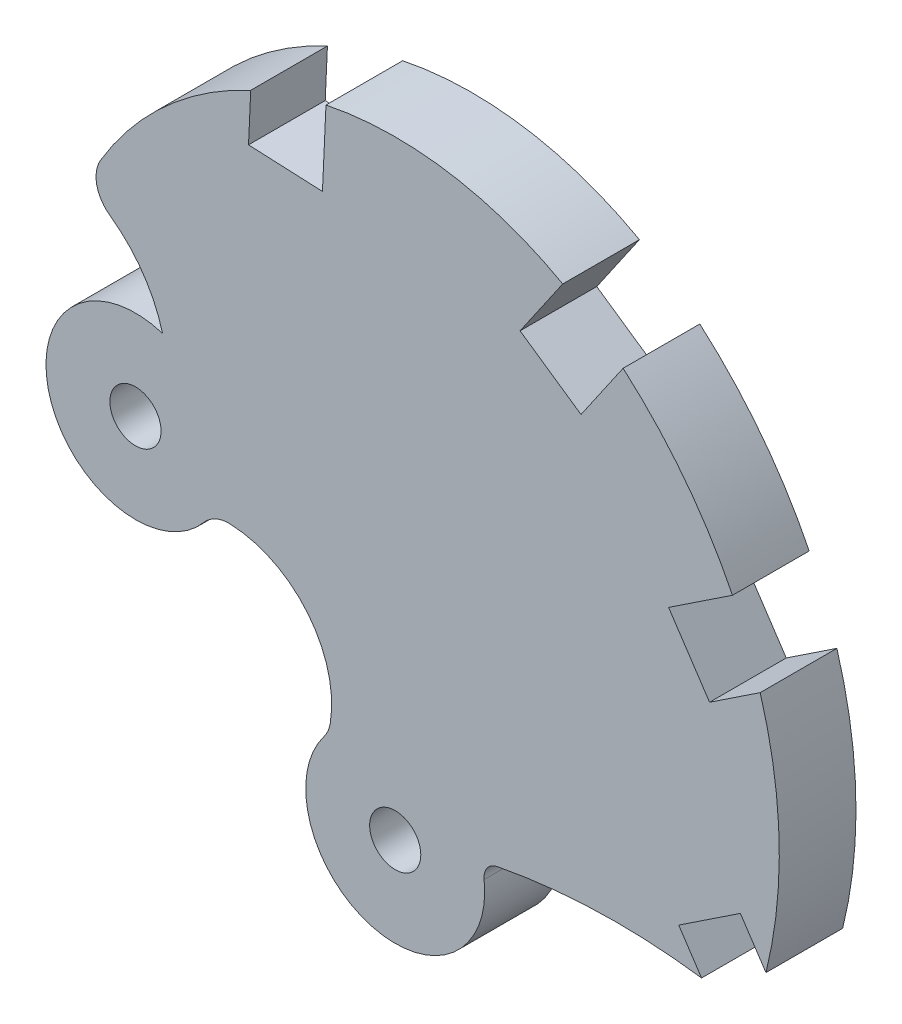
ISO-10303-21;
HEADER;
FILE_DESCRIPTION(('STEP AP214'),'2;1');
FILE_NAME('part.step','',(''),(''),'','','');
FILE_SCHEMA(('AUTOMOTIVE_DESIGN { 1 0 10303 214 1 1 1 1 }'));
ENDSEC;
DATA;
#1=APPLICATION_CONTEXT('core data for automotive mechanical design processes');
#2=APPLICATION_PROTOCOL_DEFINITION('international standard','automotive_design',2000,#1);
#3=PRODUCT_CONTEXT('',#1,'mechanical');
#4=PRODUCT('Part','Part','',(#3));
#5=PRODUCT_RELATED_PRODUCT_CATEGORY('part','',(#4));
#6=PRODUCT_DEFINITION_FORMATION('','',#4);
#7=PRODUCT_DEFINITION_CONTEXT('part definition',#1,'design');
#8=PRODUCT_DEFINITION('design','',#6,#7);
#9=PRODUCT_DEFINITION_SHAPE('','',#8);
#10=(LENGTH_UNIT() NAMED_UNIT(*) SI_UNIT(.MILLI.,.METRE.));
#11=(NAMED_UNIT(*) PLANE_ANGLE_UNIT() SI_UNIT($,.RADIAN.));
#12=(NAMED_UNIT(*) SI_UNIT($,.STERADIAN.) SOLID_ANGLE_UNIT());
#13=UNCERTAINTY_MEASURE_WITH_UNIT(LENGTH_MEASURE(1.E-05),#10,'distance_accuracy_value','');
#14=(GEOMETRIC_REPRESENTATION_CONTEXT(3) GLOBAL_UNCERTAINTY_ASSIGNED_CONTEXT((#13)) GLOBAL_UNIT_ASSIGNED_CONTEXT((#10,
#11,#12)) REPRESENTATION_CONTEXT('',''));
#15=CARTESIAN_POINT('',(0.,0.,0.));
#16=DIRECTION('',(0.,0.,1.));
#17=DIRECTION('',(1.,0.,0.));
#18=AXIS2_PLACEMENT_3D('',#15,#16,#17);
#19=CARTESIAN_POINT('',(-2.73925538904943,-4.39429765982886,3.));
#20=DIRECTION('',(0.,0.,-1.));
#21=DIRECTION('',(-1.,0.,0.));
#22=AXIS2_PLACEMENT_3D('',#19,#20,#21);
#23=CYLINDRICAL_SURFACE('',#22,17.7611539613749);
#24=CARTESIAN_POINT('',(-2.73925538904943,-4.39429765982886,3.));
#25=DIRECTION('',(0.,0.,1.));
#26=DIRECTION('',(1.,0.,0.));
#27=AXIS2_PLACEMENT_3D('',#24,#25,#26);
#28=CIRCLE('',#27,17.7611539613749);
#29=CARTESIAN_POINT('',(14.500260416586,-8.66719887877946,3.));
#30=VERTEX_POINT('',#29);
#31=CARTESIAN_POINT('',(14.2743151893826,0.704428280283741,3.));
#32=VERTEX_POINT('',#31);
#33=EDGE_CURVE('E307',#30,#32,#28,.T.);
#34=ORIENTED_EDGE('',*,*,#33,.F.);
#35=DIRECTION('',(0.,0.,-1.));
#36=VECTOR('',#35,1.);
#37=CARTESIAN_POINT('',(14.500260416586,-8.66719887877946,3.));
#38=LINE('',#37,#36);
#39=CARTESIAN_POINT('',(14.500260416586,-8.66719887877946,0.));
#40=VERTEX_POINT('',#39);
#41=EDGE_CURVE('E407',#30,#40,#38,.T.);
#42=ORIENTED_EDGE('',*,*,#41,.T.);
#43=CARTESIAN_POINT('',(-2.73925538904943,-4.39429765982886,0.));
#44=DIRECTION('',(0.,0.,1.));
#45=DIRECTION('',(1.,0.,0.));
#46=AXIS2_PLACEMENT_3D('',#43,#44,#45);
#47=CIRCLE('',#46,17.7611539613749);
#48=CARTESIAN_POINT('',(14.2743151893826,0.704428280283742,0.));
#49=VERTEX_POINT('',#48);
#50=EDGE_CURVE('E246',#40,#49,#47,.T.);
#51=ORIENTED_EDGE('',*,*,#50,.T.);
#52=DIRECTION('',(0.,0.,-1.));
#53=VECTOR('',#52,1.);
#54=CARTESIAN_POINT('',(14.2743151893826,0.704428280283741,3.));
#55=LINE('',#54,#53);
#56=EDGE_CURVE('E406',#49,#32,#55,.F.);
#57=ORIENTED_EDGE('',*,*,#56,.T.);
#58=EDGE_LOOP('',(#34,#42,#51,#57));
#59=FACE_BOUND('',#58,.T.);
#60=ADVANCED_FACE('F46',(#59),#23,.T.);
#61=CARTESIAN_POINT('',(0.00198255892141282,-1.02045917485868,3.));
#62=DIRECTION('',(0.,0.,-1.));
#63=DIRECTION('',(-1.,0.,0.));
#64=AXIS2_PLACEMENT_3D('',#61,#62,#63);
#65=CYLINDRICAL_SURFACE('',#64,13.4140662454367);
#66=CARTESIAN_POINT('',(0.00198255892141282,-1.02045917485868,0.));
#67=DIRECTION('',(0.,0.,1.));
#68=DIRECTION('',(1.,0.,0.));
#69=AXIS2_PLACEMENT_3D('',#66,#67,#68);
#70=CIRCLE('',#69,13.4140662454367);
#71=CARTESIAN_POINT('',(-5.65150878154197,11.144046935143,0.));
#72=VERTEX_POINT('',#71);
#73=CARTESIAN_POINT('',(-11.5224025717488,5.84435841899993,0.));
#74=VERTEX_POINT('',#73);
#75=EDGE_CURVE('E239',#72,#74,#70,.T.);
#76=ORIENTED_EDGE('',*,*,#75,.T.);
#77=DIRECTION('',(0.,0.,-1.));
#78=VECTOR('',#77,1.);
#79=CARTESIAN_POINT('',(-11.5224025717488,5.84435841899993,3.));
#80=LINE('',#79,#78);
#81=CARTESIAN_POINT('',(-11.5224025717488,5.84435841899993,3.));
#82=VERTEX_POINT('',#81);
#83=EDGE_CURVE('E277',#74,#82,#80,.F.);
#84=ORIENTED_EDGE('',*,*,#83,.T.);
#85=CARTESIAN_POINT('',(0.00198255892141282,-1.02045917485868,3.));
#86=DIRECTION('',(0.,0.,1.));
#87=DIRECTION('',(1.,0.,0.));
#88=AXIS2_PLACEMENT_3D('',#85,#86,#87);
#89=CIRCLE('',#88,13.4140662454367);
#90=CARTESIAN_POINT('',(-5.65150878154197,11.144046935143,3.));
#91=VERTEX_POINT('',#90);
#92=EDGE_CURVE('E309',#91,#82,#89,.T.);
#93=ORIENTED_EDGE('',*,*,#92,.F.);
#94=DIRECTION('',(0.,0.,-1.));
#95=VECTOR('',#94,1.);
#96=CARTESIAN_POINT('',(-5.65150878154197,11.144046935143,3.));
#97=LINE('',#96,#95);
#98=EDGE_CURVE('E440',#91,#72,#97,.T.);
#99=ORIENTED_EDGE('',*,*,#98,.T.);
#100=EDGE_LOOP('',(#76,#84,#93,#99));
#101=FACE_BOUND('',#100,.T.);
#102=ADVANCED_FACE('F461',(#101),#65,.T.);
#103=CARTESIAN_POINT('',(-14.2785590329737,-0.209253415948847,3.));
#104=DIRECTION('',(0.,0.,-1.));
#105=DIRECTION('',(-1.,0.,0.));
#106=AXIS2_PLACEMENT_3D('',#103,#104,#105);
#107=CYLINDRICAL_SURFACE('',#106,5.36332492629214);
#108=CARTESIAN_POINT('',(-14.2785590329737,-0.209253415948847,3.));
#109=DIRECTION('',(0.,0.,1.));
#110=DIRECTION('',(1.,0.,0.));
#111=AXIS2_PLACEMENT_3D('',#108,#109,#110);
#112=CIRCLE('',#111,5.36332492629214);
#113=CARTESIAN_POINT('',(-11.1678959341248,4.15984595925959,3.));
#114=VERTEX_POINT('',#113);
#115=CARTESIAN_POINT('',(-9.09888582661014,1.18223490245933,3.));
#116=VERTEX_POINT('',#115);
#117=EDGE_CURVE('E296',#114,#116,#112,.F.);
#118=ORIENTED_EDGE('',*,*,#117,.F.);
#119=DIRECTION('',(0.,0.,-1.));
#120=VECTOR('',#119,1.);
#121=CARTESIAN_POINT('',(-11.1678959341248,4.15984595925959,3.));
#122=LINE('',#121,#120);
#123=CARTESIAN_POINT('',(-11.1678959341248,4.15984595925959,0.));
#124=VERTEX_POINT('',#123);
#125=EDGE_CURVE('E271',#114,#124,#122,.T.);
#126=ORIENTED_EDGE('',*,*,#125,.T.);
#127=CARTESIAN_POINT('',(-14.2785590329737,-0.209253415948847,0.));
#128=DIRECTION('',(0.,0.,1.));
#129=DIRECTION('',(1.,0.,0.));
#130=AXIS2_PLACEMENT_3D('',#127,#128,#129);
#131=CIRCLE('',#130,5.36332492629214);
#132=CARTESIAN_POINT('',(-9.09888582661014,1.18223490245933,0.));
#133=VERTEX_POINT('',#132);
#134=EDGE_CURVE('E377',#124,#133,#131,.F.);
#135=ORIENTED_EDGE('',*,*,#134,.T.);
#136=DIRECTION('',(0.,0.,-1.));
#137=VECTOR('',#136,1.);
#138=CARTESIAN_POINT('',(-9.09888582661014,1.18223490245933,3.));
#139=LINE('',#138,#137);
#140=EDGE_CURVE('E252',#116,#133,#139,.T.);
#141=ORIENTED_EDGE('',*,*,#140,.F.);
#142=EDGE_LOOP('',(#118,#126,#135,#141));
#143=FACE_BOUND('',#142,.T.);
#144=ADVANCED_FACE('F380',(#143),#107,.F.);
#145=CARTESIAN_POINT('',(-10.1600000000004,-2.15303670732482,3.));
#146=DIRECTION('',(0.,0.,-1.));
#147=DIRECTION('',(-1.,0.,0.));
#148=AXIS2_PLACEMENT_3D('',#145,#146,#147);
#149=CYLINDRICAL_SURFACE('',#148,3.50000000000026);
#150=CARTESIAN_POINT('',(-10.1600000000004,-2.15303670732482,0.));
#151=DIRECTION('',(0.,0.,1.));
#152=DIRECTION('',(1.,0.,0.));
#153=AXIS2_PLACEMENT_3D('',#150,#151,#152);
#154=CIRCLE('',#153,3.50000000000026);
#155=CARTESIAN_POINT('',(-7.47853161323977,-4.40242046533616,0.));
#156=VERTEX_POINT('',#155);
#157=EDGE_CURVE('E378',#133,#156,#154,.T.);
#158=ORIENTED_EDGE('',*,*,#157,.T.);
#159=DIRECTION('',(0.,0.,-1.));
#160=VECTOR('',#159,1.);
#161=CARTESIAN_POINT('',(-7.47853161323977,-4.40242046533616,3.));
#162=LINE('',#161,#160);
#163=CARTESIAN_POINT('',(-7.47853161323977,-4.40242046533616,3.));
#164=VERTEX_POINT('',#163);
#165=EDGE_CURVE('E61',#156,#164,#162,.F.);
#166=ORIENTED_EDGE('',*,*,#165,.T.);
#167=CARTESIAN_POINT('',(-10.1600000000004,-2.15303670732482,3.));
#168=DIRECTION('',(0.,0.,1.));
#169=DIRECTION('',(1.,0.,0.));
#170=AXIS2_PLACEMENT_3D('',#167,#168,#169);
#171=CIRCLE('',#170,3.50000000000026);
#172=EDGE_CURVE('E291',#116,#164,#171,.T.);
#173=ORIENTED_EDGE('',*,*,#172,.F.);
#174=ORIENTED_EDGE('',*,*,#140,.T.);
#175=EDGE_LOOP('',(#158,#166,#173,#174));
#176=FACE_BOUND('',#175,.T.);
#177=ADVANCED_FACE('F376',(#176),#149,.T.);
#178=CARTESIAN_POINT('',(-6.61268086064139,-8.07337844667435,3.));
#179=DIRECTION('',(0.,0.,-1.));
#180=DIRECTION('',(-1.,0.,0.));
#181=AXIS2_PLACEMENT_3D('',#178,#179,#180);
#182=CYLINDRICAL_SURFACE('',#181,4.12676278353441);
#183=CARTESIAN_POINT('',(-6.61268086064139,-8.07337844667435,0.));
#184=DIRECTION('',(0.,0.,1.));
#185=DIRECTION('',(1.,0.,0.));
#186=AXIS2_PLACEMENT_3D('',#183,#184,#185);
#187=CIRCLE('',#186,4.12676278353441);
#188=CARTESIAN_POINT('',(-6.45791194320867,-3.94951888871637,0.));
#189=VERTEX_POINT('',#188);
#190=CARTESIAN_POINT('',(-2.54111869295091,-8.74609873490439,0.));
#191=VERTEX_POINT('',#190);
#192=EDGE_CURVE('E385',#189,#191,#187,.F.);
#193=ORIENTED_EDGE('',*,*,#192,.T.);
#194=DIRECTION('',(0.,0.,-1.));
#195=VECTOR('',#194,1.);
#196=CARTESIAN_POINT('',(-2.54111869295091,-8.74609873490439,3.));
#197=LINE('',#196,#195);
#198=CARTESIAN_POINT('',(-2.54111869295091,-8.74609873490439,3.));
#199=VERTEX_POINT('',#198);
#200=EDGE_CURVE('E765',#191,#199,#197,.F.);
#201=ORIENTED_EDGE('',*,*,#200,.T.);
#202=CARTESIAN_POINT('',(-6.61268086064139,-8.07337844667435,3.));
#203=DIRECTION('',(0.,0.,1.));
#204=DIRECTION('',(1.,0.,0.));
#205=AXIS2_PLACEMENT_3D('',#202,#203,#204);
#206=CIRCLE('',#205,4.12676278353441);
#207=CARTESIAN_POINT('',(-6.45791194320867,-3.94951888871637,3.));
#208=VERTEX_POINT('',#207);
#209=EDGE_CURVE('E300',#208,#199,#206,.F.);
#210=ORIENTED_EDGE('',*,*,#209,.F.);
#211=DIRECTION('',(0.,0.,-1.));
#212=VECTOR('',#211,1.);
#213=CARTESIAN_POINT('',(-6.45791194320867,-3.94951888871637,3.));
#214=LINE('',#213,#212);
#215=EDGE_CURVE('E759',#208,#189,#214,.T.);
#216=ORIENTED_EDGE('',*,*,#215,.T.);
#217=EDGE_LOOP('',(#193,#201,#210,#216));
#218=FACE_BOUND('',#217,.T.);
#219=ADVANCED_FACE('F479',(#218),#182,.F.);
#220=CARTESIAN_POINT('',(0.,-11.43,3.));
#221=DIRECTION('',(0.,0.,-1.));
#222=DIRECTION('',(-1.,0.,0.));
#223=AXIS2_PLACEMENT_3D('',#220,#221,#222);
#224=CYLINDRICAL_SURFACE('',#223,3.5);
#225=CARTESIAN_POINT('',(0.,-11.43,3.));
#226=DIRECTION('',(0.,0.,1.));
#227=DIRECTION('',(1.,0.,0.));
#228=AXIS2_PLACEMENT_3D('',#225,#226,#227);
#229=CIRCLE('',#228,3.5);
#230=CARTESIAN_POINT('',(3.47676773840876,-11.0274008281677,3.));
#231=VERTEX_POINT('',#230);
#232=CARTESIAN_POINT('',(-2.78395345671269,-9.30877319674263,3.));
#233=VERTEX_POINT('',#232);
#234=EDGE_CURVE('E301',#231,#233,#229,.F.);
#235=ORIENTED_EDGE('',*,*,#234,.T.);
#236=DIRECTION('',(0.,0.,-1.));
#237=VECTOR('',#236,1.);
#238=CARTESIAN_POINT('',(-2.78395345671269,-9.30877319674263,3.));
#239=LINE('',#238,#237);
#240=CARTESIAN_POINT('',(-2.78395345671269,-9.30877319674263,0.));
#241=VERTEX_POINT('',#240);
#242=EDGE_CURVE('E284',#233,#241,#239,.T.);
#243=ORIENTED_EDGE('',*,*,#242,.T.);
#244=CARTESIAN_POINT('',(0.,-11.43,0.));
#245=DIRECTION('',(0.,0.,1.));
#246=DIRECTION('',(1.,0.,0.));
#247=AXIS2_PLACEMENT_3D('',#244,#245,#246);
#248=CIRCLE('',#247,3.5);
#249=CARTESIAN_POINT('',(3.47676773840876,-11.0274008281677,0.));
#250=VERTEX_POINT('',#249);
#251=EDGE_CURVE('E383',#250,#241,#248,.F.);
#252=ORIENTED_EDGE('',*,*,#251,.F.);
#253=DIRECTION('',(0.,0.,-1.));
#254=VECTOR('',#253,1.);
#255=CARTESIAN_POINT('',(3.47676773840876,-11.0274008281677,3.));
#256=LINE('',#255,#254);
#257=EDGE_CURVE('E270',#250,#231,#256,.F.);
#258=ORIENTED_EDGE('',*,*,#257,.T.);
#259=EDGE_LOOP('',(#235,#243,#252,#258));
#260=FACE_BOUND('',#259,.T.);
#261=ADVANCED_FACE('F474',(#260),#224,.T.);
#262=CARTESIAN_POINT('',(8.65845108407736,-34.407974603099,3.));
#263=DIRECTION('',(0.,0.,-1.));
#264=DIRECTION('',(-1.,0.,0.));
#265=AXIS2_PLACEMENT_3D('',#262,#263,#264);
#266=CYLINDRICAL_SURFACE('',#265,24.5260614078758);
#267=CARTESIAN_POINT('',(8.65845108407736,-34.407974603099,3.));
#268=DIRECTION('',(0.,0.,1.));
#269=DIRECTION('',(1.,0.,0.));
#270=AXIS2_PLACEMENT_3D('',#267,#268,#269);
#271=CIRCLE('',#270,24.5260614078758);
#272=CARTESIAN_POINT('',(3.98659451462651,-10.3309846671171,3.));
#273=VERTEX_POINT('',#272);
#274=CARTESIAN_POINT('',(11.98188014566,-10.1081287711698,3.));
#275=VERTEX_POINT('',#274);
#276=EDGE_CURVE('E302',#273,#275,#271,.F.);
#277=ORIENTED_EDGE('',*,*,#276,.F.);
#278=DIRECTION('',(0.,0.,-1.));
#279=VECTOR('',#278,1.);
#280=CARTESIAN_POINT('',(3.98659451462651,-10.3309846671171,3.));
#281=LINE('',#280,#279);
#282=CARTESIAN_POINT('',(3.98659451462651,-10.3309846671171,0.));
#283=VERTEX_POINT('',#282);
#284=EDGE_CURVE('E263',#273,#283,#281,.T.);
#285=ORIENTED_EDGE('',*,*,#284,.T.);
#286=CARTESIAN_POINT('',(8.65845108407736,-34.407974603099,0.));
#287=DIRECTION('',(0.,0.,1.));
#288=DIRECTION('',(1.,0.,0.));
#289=AXIS2_PLACEMENT_3D('',#286,#287,#288);
#290=CIRCLE('',#289,24.5260614078758);
#291=CARTESIAN_POINT('',(11.98188014566,-10.1081287711698,0.));
#292=VERTEX_POINT('',#291);
#293=EDGE_CURVE('E389',#283,#292,#290,.F.);
#294=ORIENTED_EDGE('',*,*,#293,.T.);
#295=DIRECTION('',(0.,0.,-1.));
#296=VECTOR('',#295,1.);
#297=CARTESIAN_POINT('',(11.98188014566,-10.1081287711698,3.));
#298=LINE('',#297,#296);
#299=EDGE_CURVE('E359',#292,#275,#298,.F.);
#300=ORIENTED_EDGE('',*,*,#299,.T.);
#301=EDGE_LOOP('',(#277,#285,#294,#300));
#302=FACE_BOUND('',#301,.T.);
#303=ADVANCED_FACE('F462',(#302),#266,.F.);
#304=CARTESIAN_POINT('',(13.1907331174678,3.46025873896884,0.));
#305=VERTEX_POINT('',#304);
#306=CARTESIAN_POINT('',(8.91289603956994,9.01040140893756,0.));
#307=VERTEX_POINT('',#306);
#308=EDGE_CURVE('E248',#305,#307,#47,.T.);
#309=ORIENTED_EDGE('',*,*,#308,.T.);
#310=DIRECTION('',(0.,0.,-1.));
#311=VECTOR('',#310,1.);
#312=CARTESIAN_POINT('',(8.91289603956994,9.01040140893756,3.));
#313=LINE('',#312,#311);
#314=CARTESIAN_POINT('',(8.91289603956994,9.01040140893756,3.));
#315=VERTEX_POINT('',#314);
#316=EDGE_CURVE('E439',#307,#315,#313,.F.);
#317=ORIENTED_EDGE('',*,*,#316,.T.);
#318=CARTESIAN_POINT('',(13.1907331174678,3.46025873896884,3.));
#319=VERTEX_POINT('',#318);
#320=EDGE_CURVE('E306',#319,#315,#28,.T.);
#321=ORIENTED_EDGE('',*,*,#320,.F.);
#322=DIRECTION('',(0.,0.,1.));
#323=VECTOR('',#322,1.);
#324=CARTESIAN_POINT('',(13.1907331174678,3.46025873896884,-5.7975465376223));
#325=LINE('',#324,#323);
#326=EDGE_CURVE('E427',#305,#319,#325,.T.);
#327=ORIENTED_EDGE('',*,*,#326,.F.);
#328=EDGE_LOOP('',(#309,#317,#321,#327));
#329=FACE_BOUND('',#328,.T.);
#330=ADVANCED_FACE('F452',(#329),#23,.T.);
#331=CARTESIAN_POINT('',(0.,-11.43,3.));
#332=DIRECTION('',(0.,0.,-1.));
#333=DIRECTION('',(-1.,0.,0.));
#334=AXIS2_PLACEMENT_3D('',#331,#332,#333);
#335=CYLINDRICAL_SURFACE('',#334,1.);
#336=CARTESIAN_POINT('',(0.,-11.43,3.));
#337=DIRECTION('',(0.,0.,1.));
#338=DIRECTION('',(1.,0.,0.));
#339=AXIS2_PLACEMENT_3D('',#336,#337,#338);
#340=CIRCLE('',#339,1.);
#341=CARTESIAN_POINT('',(1.,-11.43,3.));
#342=VERTEX_POINT('',#341);
#343=EDGE_CURVE('E243',#342,#342,#340,.T.);
#344=ORIENTED_EDGE('',*,*,#343,.T.);
#345=EDGE_LOOP('',(#344));
#346=FACE_BOUND('',#345,.T.);
#347=CARTESIAN_POINT('',(0.,-11.43,0.));
#348=DIRECTION('',(0.,0.,1.));
#349=DIRECTION('',(1.,0.,0.));
#350=AXIS2_PLACEMENT_3D('',#347,#348,#349);
#351=CIRCLE('',#350,1.);
#352=CARTESIAN_POINT('',(1.,-11.43,0.));
#353=VERTEX_POINT('',#352);
#354=EDGE_CURVE('E379',#353,#353,#351,.T.);
#355=ORIENTED_EDGE('',*,*,#354,.F.);
#356=EDGE_LOOP('',(#355));
#357=FACE_BOUND('',#356,.T.);
#358=ADVANCED_FACE('F448',(#346,#357),#335,.F.);
#359=CARTESIAN_POINT('',(-10.16,-2.15303670732468,3.));
#360=DIRECTION('',(0.,0.,-1.));
#361=DIRECTION('',(-1.,0.,0.));
#362=AXIS2_PLACEMENT_3D('',#359,#360,#361);
#363=CYLINDRICAL_SURFACE('',#362,1.);
#364=CARTESIAN_POINT('',(-10.16,-2.15303670732468,3.));
#365=DIRECTION('',(0.,0.,1.));
#366=DIRECTION('',(1.,0.,0.));
#367=AXIS2_PLACEMENT_3D('',#364,#365,#366);
#368=CIRCLE('',#367,1.);
#369=CARTESIAN_POINT('',(-9.16,-2.15303670732468,3.));
#370=VERTEX_POINT('',#369);
#371=EDGE_CURVE('E237',#370,#370,#368,.T.);
#372=ORIENTED_EDGE('',*,*,#371,.T.);
#373=EDGE_LOOP('',(#372));
#374=FACE_BOUND('',#373,.T.);
#375=CARTESIAN_POINT('',(-10.16,-2.15303670732468,0.));
#376=DIRECTION('',(0.,0.,1.));
#377=DIRECTION('',(1.,0.,0.));
#378=AXIS2_PLACEMENT_3D('',#375,#376,#377);
#379=CIRCLE('',#378,1.);
#380=CARTESIAN_POINT('',(-9.16,-2.15303670732468,0.));
#381=VERTEX_POINT('',#380);
#382=EDGE_CURVE('E445',#381,#381,#379,.T.);
#383=ORIENTED_EDGE('',*,*,#382,.F.);
#384=EDGE_LOOP('',(#383));
#385=FACE_BOUND('',#384,.T.);
#386=ADVANCED_FACE('F455',(#374,#385),#363,.F.);
#387=CARTESIAN_POINT('',(6.55167617947279,10.6858932337215,3.));
#388=VERTEX_POINT('',#387);
#389=CARTESIAN_POINT('',(-2.7088738109248,12.1168324401977,3.));
#390=VERTEX_POINT('',#389);
#391=EDGE_CURVE('E253',#388,#390,#89,.T.);
#392=ORIENTED_EDGE('',*,*,#391,.F.);
#393=DIRECTION('',(0.,0.,-1.));
#394=VECTOR('',#393,1.);
#395=CARTESIAN_POINT('',(6.55167617947279,10.6858932337215,3.));
#396=LINE('',#395,#394);
#397=CARTESIAN_POINT('',(6.55167617947279,10.6858932337215,0.));
#398=VERTEX_POINT('',#397);
#399=EDGE_CURVE('E238',#388,#398,#396,.T.);
#400=ORIENTED_EDGE('',*,*,#399,.T.);
#401=CARTESIAN_POINT('',(-2.7088738109248,12.1168324401977,0.));
#402=VERTEX_POINT('',#401);
#403=EDGE_CURVE('E233',#398,#402,#70,.T.);
#404=ORIENTED_EDGE('',*,*,#403,.T.);
#405=DIRECTION('',(0.,0.,1.));
#406=VECTOR('',#405,1.);
#407=CARTESIAN_POINT('',(-2.7088738109248,12.1168324401977,-5.7975465376223));
#408=LINE('',#407,#406);
#409=EDGE_CURVE('E212',#402,#390,#408,.T.);
#410=ORIENTED_EDGE('',*,*,#409,.T.);
#411=EDGE_LOOP('',(#392,#400,#404,#410));
#412=FACE_BOUND('',#411,.T.);
#413=ADVANCED_FACE('F240',(#412),#65,.T.);
#414=CARTESIAN_POINT('',(0.,0.,3.));
#415=DIRECTION('',(0.,0.,1.));
#416=DIRECTION('',(1.,0.,0.));
#417=AXIS2_PLACEMENT_3D('',#414,#415,#416);
#418=PLANE('',#417);
#419=ORIENTED_EDGE('',*,*,#92,.T.);
#420=CARTESIAN_POINT('',(-10.4313114105634,5.19441990038211,3.));
#421=DIRECTION('',(0.,0.,1.));
#422=DIRECTION('',(1.,0.,0.));
#423=AXIS2_PLACEMENT_3D('',#420,#421,#422);
#424=CIRCLE('',#423,1.27);
#425=EDGE_CURVE('E279',#82,#114,#424,.T.);
#426=ORIENTED_EDGE('',*,*,#425,.T.);
#427=ORIENTED_EDGE('',*,*,#117,.T.);
#428=ORIENTED_EDGE('',*,*,#172,.T.);
#429=CARTESIAN_POINT('',(-6.50554165575813,-5.21862542895736,3.));
#430=DIRECTION('',(0.,0.,1.));
#431=DIRECTION('',(1.,0.,0.));
#432=AXIS2_PLACEMENT_3D('',#429,#430,#431);
#433=CIRCLE('',#432,1.27);
#434=EDGE_CURVE('E12',#164,#208,#433,.F.);
#435=ORIENTED_EDGE('',*,*,#434,.T.);
#436=ORIENTED_EDGE('',*,*,#209,.T.);
#437=CARTESIAN_POINT('',(-3.79413085386272,-8.53907089956067,3.));
#438=DIRECTION('',(0.,0.,1.));
#439=DIRECTION('',(1.,0.,0.));
#440=AXIS2_PLACEMENT_3D('',#437,#438,#439);
#441=CIRCLE('',#440,1.27);
#442=EDGE_CURVE('E760',#199,#233,#441,.F.);
#443=ORIENTED_EDGE('',*,*,#442,.T.);
#444=ORIENTED_EDGE('',*,*,#234,.F.);
#445=CARTESIAN_POINT('',(4.1075527423772,-10.9543578355639,3.));
#446=DIRECTION('',(0.,0.,1.));
#447=DIRECTION('',(1.,0.,0.));
#448=AXIS2_PLACEMENT_3D('',#445,#446,#447);
#449=CIRCLE('',#448,0.635);
#450=EDGE_CURVE('E272',#231,#273,#449,.F.);
#451=ORIENTED_EDGE('',*,*,#450,.T.);
#452=ORIENTED_EDGE('',*,*,#276,.T.);
#453=DIRECTION('',(0.553438220024881,-0.832890230832185,0.));
#454=VECTOR('',#453,1.);
#455=CARTESIAN_POINT('',(11.0879614573783,-8.76283653133386,3.));
#456=LINE('',#455,#454);
#457=CARTESIAN_POINT('',(11.0879614573783,-8.76283653133386,3.));
#458=VERTEX_POINT('',#457);
#459=EDGE_CURVE('E735',#458,#275,#456,.T.);
#460=ORIENTED_EDGE('',*,*,#459,.F.);
#461=DIRECTION('',(-0.832890230832186,-0.553438220024881,0.));
#462=VECTOR('',#461,1.);
#463=CARTESIAN_POINT('',(11.0879614573783,-8.76283653133386,3.));
#464=LINE('',#463,#462);
#465=CARTESIAN_POINT('',(13.4991786756375,-7.16063288436183,3.));
#466=VERTEX_POINT('',#465);
#467=EDGE_CURVE('E738',#466,#458,#464,.T.);
#468=ORIENTED_EDGE('',*,*,#467,.F.);
#469=DIRECTION('',(-0.553438220024881,0.832890230832186,0.));
#470=VECTOR('',#469,1.);
#471=CARTESIAN_POINT('',(13.4991786756375,-7.16063288436183,3.));
#472=LINE('',#471,#470);
#473=EDGE_CURVE('E736',#30,#466,#472,.T.);
#474=ORIENTED_EDGE('',*,*,#473,.F.);
#475=ORIENTED_EDGE('',*,*,#33,.T.);
#476=DIRECTION('',(0.832890230832185,0.553438220024881,0.));
#477=VECTOR('',#476,1.);
#478=CARTESIAN_POINT('',(12.2942660719432,-0.611273139364979,3.));
#479=LINE('',#478,#477);
#480=CARTESIAN_POINT('',(12.2942660719432,-0.611273139364979,3.));
#481=VERTEX_POINT('',#480);
#482=EDGE_CURVE('E357',#481,#32,#479,.T.);
#483=ORIENTED_EDGE('',*,*,#482,.F.);
#484=DIRECTION('',(0.553438220024882,-0.832890230832185,0.));
#485=VECTOR('',#484,1.);
#486=CARTESIAN_POINT('',(12.2942660719432,-0.611273139364979,3.));
#487=LINE('',#486,#485);
#488=CARTESIAN_POINT('',(10.6920624249712,1.7999440788942,3.));
#489=VERTEX_POINT('',#488);
#490=EDGE_CURVE('E425',#489,#481,#487,.T.);
#491=ORIENTED_EDGE('',*,*,#490,.F.);
#492=DIRECTION('',(-0.832890230832185,-0.553438220024881,0.));
#493=VECTOR('',#492,1.);
#494=CARTESIAN_POINT('',(10.6920624249712,1.7999440788942,3.));
#495=LINE('',#494,#493);
#496=EDGE_CURVE('E725',#319,#489,#495,.T.);
#497=ORIENTED_EDGE('',*,*,#496,.F.);
#498=ORIENTED_EDGE('',*,*,#320,.T.);
#499=DIRECTION('',(0.56735058589731,0.82347635830179,0.));
#500=VECTOR('',#499,1.);
#501=CARTESIAN_POINT('',(7.26660220227405,6.62090171063906,3.));
#502=LINE('',#501,#500);
#503=CARTESIAN_POINT('',(7.26660220227405,6.62090171063906,3.));
#504=VERTEX_POINT('',#503);
#505=EDGE_CURVE('E326',#504,#315,#502,.T.);
#506=ORIENTED_EDGE('',*,*,#505,.F.);
#507=DIRECTION('',(0.82347635830179,-0.567350585897311,0.));
#508=VECTOR('',#507,1.);
#509=CARTESIAN_POINT('',(4.88263814499037,8.26338165681178,3.));
#510=LINE('',#509,#508);
#511=CARTESIAN_POINT('',(4.88263814499037,8.26338165681178,3.));
#512=VERTEX_POINT('',#511);
#513=EDGE_CURVE('E328',#512,#504,#510,.T.);
#514=ORIENTED_EDGE('',*,*,#513,.F.);
#515=DIRECTION('',(-0.567350585897311,-0.82347635830179,0.));
#516=VECTOR('',#515,1.);
#517=CARTESIAN_POINT('',(4.88263814499037,8.26338165681178,3.));
#518=LINE('',#517,#516);
#519=EDGE_CURVE('E337',#388,#512,#518,.T.);
#520=ORIENTED_EDGE('',*,*,#519,.F.);
#521=ORIENTED_EDGE('',*,*,#391,.T.);
#522=DIRECTION('',(0.0457941137852183,0.998950899265137,0.));
#523=VECTOR('',#522,1.);
#524=CARTESIAN_POINT('',(-2.84625615228046,9.11997974240217,3.));
#525=LINE('',#524,#523);
#526=CARTESIAN_POINT('',(-2.84625615228046,9.11997974240217,3.));
#527=VERTEX_POINT('',#526);
#528=EDGE_CURVE('E218',#527,#390,#525,.T.);
#529=ORIENTED_EDGE('',*,*,#528,.F.);
#530=DIRECTION('',(0.998950899265137,-0.0457941137852306,0.));
#531=VECTOR('',#530,1.);
#532=CARTESIAN_POINT('',(-5.73821900565303,9.25255370181041,3.));
#533=LINE('',#532,#531);
#534=CARTESIAN_POINT('',(-5.73821900565303,9.25255370181041,3.));
#535=VERTEX_POINT('',#534);
#536=EDGE_CURVE('E349',#535,#527,#533,.T.);
#537=ORIENTED_EDGE('',*,*,#536,.F.);
#538=DIRECTION('',(-0.045794113785231,-0.998950899265137,0.));
#539=VECTOR('',#538,1.);
#540=CARTESIAN_POINT('',(-5.73821900565303,9.25255370181041,3.));
#541=LINE('',#540,#539);
#542=EDGE_CURVE('E354',#91,#535,#541,.T.);
#543=ORIENTED_EDGE('',*,*,#542,.F.);
#544=EDGE_LOOP('',(#419,#426,#427,#428,#435,#436,#443,#444,#451,#452,#460,#468,#474,#475,#483,
#491,#497,#498,#506,#514,#520,#521,#529,#537,#543));
#545=FACE_BOUND('',#544,.T.);
#546=ORIENTED_EDGE('',*,*,#371,.F.);
#547=EDGE_LOOP('',(#546));
#548=FACE_BOUND('',#547,.T.);
#549=ORIENTED_EDGE('',*,*,#343,.F.);
#550=EDGE_LOOP('',(#549));
#551=FACE_BOUND('',#550,.T.);
#552=ADVANCED_FACE('F367',(#545,#548,#551),#418,.T.);
#553=CARTESIAN_POINT('',(0.,0.,0.));
#554=DIRECTION('',(0.,0.,1.));
#555=DIRECTION('',(1.,0.,0.));
#556=AXIS2_PLACEMENT_3D('',#553,#554,#555);
#557=PLANE('',#556);
#558=ORIENTED_EDGE('',*,*,#134,.F.);
#559=CARTESIAN_POINT('',(-10.4313114105634,5.19441990038211,0.));
#560=DIRECTION('',(0.,0.,1.));
#561=DIRECTION('',(1.,0.,0.));
#562=AXIS2_PLACEMENT_3D('',#559,#560,#561);
#563=CIRCLE('',#562,1.27);
#564=EDGE_CURVE('E276',#124,#74,#563,.F.);
#565=ORIENTED_EDGE('',*,*,#564,.T.);
#566=ORIENTED_EDGE('',*,*,#75,.F.);
#567=DIRECTION('',(0.045794113785231,0.998950899265137,0.));
#568=VECTOR('',#567,1.);
#569=CARTESIAN_POINT('',(-5.73821900565303,9.25255370181041,0.));
#570=LINE('',#569,#568);
#571=CARTESIAN_POINT('',(-5.73821900565303,9.25255370181041,0.));
#572=VERTEX_POINT('',#571);
#573=EDGE_CURVE('E234',#572,#72,#570,.T.);
#574=ORIENTED_EDGE('',*,*,#573,.F.);
#575=DIRECTION('',(-0.998950899265137,0.0457941137852306,0.));
#576=VECTOR('',#575,1.);
#577=CARTESIAN_POINT('',(-5.73821900565303,9.25255370181041,0.));
#578=LINE('',#577,#576);
#579=CARTESIAN_POINT('',(-2.84625615228046,9.11997974240217,0.));
#580=VERTEX_POINT('',#579);
#581=EDGE_CURVE('E231',#580,#572,#578,.T.);
#582=ORIENTED_EDGE('',*,*,#581,.F.);
#583=DIRECTION('',(-0.0457941137852183,-0.998950899265137,0.));
#584=VECTOR('',#583,1.);
#585=CARTESIAN_POINT('',(-2.84625615228046,9.11997974240217,0.));
#586=LINE('',#585,#584);
#587=EDGE_CURVE('E216',#402,#580,#586,.T.);
#588=ORIENTED_EDGE('',*,*,#587,.F.);
#589=ORIENTED_EDGE('',*,*,#403,.F.);
#590=DIRECTION('',(0.567350585897311,0.82347635830179,0.));
#591=VECTOR('',#590,1.);
#592=CARTESIAN_POINT('',(4.88263814499037,8.26338165681178,0.));
#593=LINE('',#592,#591);
#594=CARTESIAN_POINT('',(4.88263814499037,8.26338165681178,0.));
#595=VERTEX_POINT('',#594);
#596=EDGE_CURVE('E339',#595,#398,#593,.T.);
#597=ORIENTED_EDGE('',*,*,#596,.F.);
#598=DIRECTION('',(-0.82347635830179,0.567350585897312,0.));
#599=VECTOR('',#598,1.);
#600=CARTESIAN_POINT('',(4.88263814499037,8.26338165681178,0.));
#601=LINE('',#600,#599);
#602=CARTESIAN_POINT('',(7.26660220227405,6.62090171063906,0.));
#603=VERTEX_POINT('',#602);
#604=EDGE_CURVE('E718',#603,#595,#601,.T.);
#605=ORIENTED_EDGE('',*,*,#604,.F.);
#606=DIRECTION('',(0.56735058589731,0.82347635830179,0.));
#607=VECTOR('',#606,1.);
#608=CARTESIAN_POINT('',(1.83429577367029,-1.26377493586695,0.));
#609=LINE('',#608,#607);
#610=EDGE_CURVE('E257',#603,#307,#609,.T.);
#611=ORIENTED_EDGE('',*,*,#610,.T.);
#612=ORIENTED_EDGE('',*,*,#308,.F.);
#613=DIRECTION('',(0.832890230832185,0.553438220024881,0.));
#614=VECTOR('',#613,1.);
#615=CARTESIAN_POINT('',(10.6920624249712,1.7999440788942,0.));
#616=LINE('',#615,#614);
#617=CARTESIAN_POINT('',(10.6920624249712,1.7999440788942,0.));
#618=VERTEX_POINT('',#617);
#619=EDGE_CURVE('E428',#618,#305,#616,.T.);
#620=ORIENTED_EDGE('',*,*,#619,.F.);
#621=DIRECTION('',(-0.553438220024882,0.832890230832185,0.));
#622=VECTOR('',#621,1.);
#623=CARTESIAN_POINT('',(12.2942660719432,-0.611273139364979,0.));
#624=LINE('',#623,#622);
#625=CARTESIAN_POINT('',(12.2942660719432,-0.611273139364979,0.));
#626=VERTEX_POINT('',#625);
#627=EDGE_CURVE('E415',#626,#618,#624,.T.);
#628=ORIENTED_EDGE('',*,*,#627,.F.);
#629=DIRECTION('',(0.832890230832185,0.553438220024881,0.));
#630=VECTOR('',#629,1.);
#631=CARTESIAN_POINT('',(4.04742661539001,-6.09112628292451,0.));
#632=LINE('',#631,#630);
#633=EDGE_CURVE('E251',#626,#49,#632,.T.);
#634=ORIENTED_EDGE('',*,*,#633,.T.);
#635=ORIENTED_EDGE('',*,*,#50,.F.);
#636=DIRECTION('',(0.553438220024881,-0.832890230832186,0.));
#637=VECTOR('',#636,1.);
#638=CARTESIAN_POINT('',(13.4991786756375,-7.16063288436183,0.));
#639=LINE('',#638,#637);
#640=CARTESIAN_POINT('',(13.4991786756375,-7.16063288436183,0.));
#641=VERTEX_POINT('',#640);
#642=EDGE_CURVE('E411',#641,#40,#639,.T.);
#643=ORIENTED_EDGE('',*,*,#642,.F.);
#644=DIRECTION('',(0.832890230832186,0.553438220024881,0.));
#645=VECTOR('',#644,1.);
#646=CARTESIAN_POINT('',(11.0879614573783,-8.76283653133386,0.));
#647=LINE('',#646,#645);
#648=CARTESIAN_POINT('',(11.0879614573783,-8.76283653133386,0.));
#649=VERTEX_POINT('',#648);
#650=EDGE_CURVE('E728',#649,#641,#647,.T.);
#651=ORIENTED_EDGE('',*,*,#650,.F.);
#652=DIRECTION('',(0.553438220024881,-0.832890230832186,0.));
#653=VECTOR('',#652,1.);
#654=CARTESIAN_POINT('',(3.65252860448786,2.42702922261195,0.));
#655=LINE('',#654,#653);
#656=EDGE_CURVE('E261',#649,#292,#655,.T.);
#657=ORIENTED_EDGE('',*,*,#656,.T.);
#658=ORIENTED_EDGE('',*,*,#293,.F.);
#659=CARTESIAN_POINT('',(4.1075527423772,-10.9543578355639,0.));
#660=DIRECTION('',(0.,0.,1.));
#661=DIRECTION('',(1.,0.,0.));
#662=AXIS2_PLACEMENT_3D('',#659,#660,#661);
#663=CIRCLE('',#662,0.635);
#664=EDGE_CURVE('E269',#283,#250,#663,.T.);
#665=ORIENTED_EDGE('',*,*,#664,.T.);
#666=ORIENTED_EDGE('',*,*,#251,.T.);
#667=CARTESIAN_POINT('',(-3.79413085386272,-8.53907089956067,0.));
#668=DIRECTION('',(0.,0.,1.));
#669=DIRECTION('',(1.,0.,0.));
#670=AXIS2_PLACEMENT_3D('',#667,#668,#669);
#671=CIRCLE('',#670,1.27);
#672=EDGE_CURVE('E757',#241,#191,#671,.T.);
#673=ORIENTED_EDGE('',*,*,#672,.T.);
#674=ORIENTED_EDGE('',*,*,#192,.F.);
#675=CARTESIAN_POINT('',(-6.50554165575813,-5.21862542895736,0.));
#676=DIRECTION('',(0.,0.,1.));
#677=DIRECTION('',(1.,0.,0.));
#678=AXIS2_PLACEMENT_3D('',#675,#676,#677);
#679=CIRCLE('',#678,1.27);
#680=EDGE_CURVE('E53',#189,#156,#679,.T.);
#681=ORIENTED_EDGE('',*,*,#680,.T.);
#682=ORIENTED_EDGE('',*,*,#157,.F.);
#683=EDGE_LOOP('',(#558,#565,#566,#574,#582,#588,#589,#597,#605,#611,#612,#620,#628,#634,#635,
#643,#651,#657,#658,#665,#666,#673,#674,#681,#682));
#684=FACE_BOUND('',#683,.T.);
#685=ORIENTED_EDGE('',*,*,#382,.T.);
#686=EDGE_LOOP('',(#685));
#687=FACE_BOUND('',#686,.T.);
#688=ORIENTED_EDGE('',*,*,#354,.T.);
#689=EDGE_LOOP('',(#688));
#690=FACE_BOUND('',#689,.T.);
#691=ADVANCED_FACE('F226',(#684,#687,#690),#557,.F.);
#692=CARTESIAN_POINT('',(12.2942660719432,-0.611273139364979,-5.7975465376223));
#693=DIRECTION('',(0.553438220024881,-0.832890230832185,0.));
#694=DIRECTION('',(0.832890230832185,0.553438220024881,0.));
#695=AXIS2_PLACEMENT_3D('',#692,#693,#694);
#696=PLANE('',#695);
#697=ORIENTED_EDGE('',*,*,#633,.F.);
#698=DIRECTION('',(0.,0.,1.));
#699=VECTOR('',#698,1.);
#700=CARTESIAN_POINT('',(12.2942660719432,-0.611273139364979,-5.7975465376223));
#701=LINE('',#700,#699);
#702=EDGE_CURVE('E419',#626,#481,#701,.T.);
#703=ORIENTED_EDGE('',*,*,#702,.T.);
#704=ORIENTED_EDGE('',*,*,#482,.T.);
#705=ORIENTED_EDGE('',*,*,#56,.F.);
#706=EDGE_LOOP('',(#697,#703,#704,#705));
#707=FACE_BOUND('',#706,.T.);
#708=ADVANCED_FACE('F418',(#707),#696,.F.);
#709=CARTESIAN_POINT('',(12.2942660719432,-0.611273139364979,-5.7975465376223));
#710=DIRECTION('',(-0.832890230832185,-0.553438220024882,0.));
#711=DIRECTION('',(0.553438220024882,-0.832890230832185,0.));
#712=AXIS2_PLACEMENT_3D('',#709,#710,#711);
#713=PLANE('',#712);
#714=ORIENTED_EDGE('',*,*,#627,.T.);
#715=DIRECTION('',(0.,0.,1.));
#716=VECTOR('',#715,1.);
#717=CARTESIAN_POINT('',(10.6920624249712,1.7999440788942,-5.7975465376223));
#718=LINE('',#717,#716);
#719=EDGE_CURVE('E430',#618,#489,#718,.T.);
#720=ORIENTED_EDGE('',*,*,#719,.T.);
#721=ORIENTED_EDGE('',*,*,#490,.T.);
#722=ORIENTED_EDGE('',*,*,#702,.F.);
#723=EDGE_LOOP('',(#714,#720,#721,#722));
#724=FACE_BOUND('',#723,.T.);
#725=ADVANCED_FACE('F422',(#724),#713,.F.);
#726=CARTESIAN_POINT('',(10.6920624249712,1.7999440788942,-5.7975465376223));
#727=DIRECTION('',(-0.553438220024881,0.832890230832185,0.));
#728=DIRECTION('',(-0.832890230832185,-0.553438220024881,0.));
#729=AXIS2_PLACEMENT_3D('',#726,#727,#728);
#730=PLANE('',#729);
#731=ORIENTED_EDGE('',*,*,#619,.T.);
#732=ORIENTED_EDGE('',*,*,#326,.T.);
#733=ORIENTED_EDGE('',*,*,#496,.T.);
#734=ORIENTED_EDGE('',*,*,#719,.F.);
#735=EDGE_LOOP('',(#731,#732,#733,#734));
#736=FACE_BOUND('',#735,.T.);
#737=ADVANCED_FACE('F634',(#736),#730,.F.);
#738=CARTESIAN_POINT('',(-5.73821900565303,9.25255370181041,-5.7975465376223));
#739=DIRECTION('',(-0.998950899265137,0.045794113785231,0.));
#740=DIRECTION('',(-0.045794113785231,-0.998950899265137,0.));
#741=AXIS2_PLACEMENT_3D('',#738,#739,#740);
#742=PLANE('',#741);
#743=ORIENTED_EDGE('',*,*,#542,.T.);
#744=DIRECTION('',(0.,0.,1.));
#745=VECTOR('',#744,1.);
#746=CARTESIAN_POINT('',(-5.73821900565303,9.25255370181041,-5.7975465376223));
#747=LINE('',#746,#745);
#748=EDGE_CURVE('E348',#572,#535,#747,.T.);
#749=ORIENTED_EDGE('',*,*,#748,.F.);
#750=ORIENTED_EDGE('',*,*,#573,.T.);
#751=ORIENTED_EDGE('',*,*,#98,.F.);
#752=EDGE_LOOP('',(#743,#749,#750,#751));
#753=FACE_BOUND('',#752,.T.);
#754=ADVANCED_FACE('F630',(#753),#742,.F.);
#755=CARTESIAN_POINT('',(-2.84625615228046,9.11997974240217,-5.7975465376223));
#756=DIRECTION('',(0.998950899265137,-0.0457941137852183,0.));
#757=DIRECTION('',(0.0457941137852183,0.998950899265137,0.));
#758=AXIS2_PLACEMENT_3D('',#755,#756,#757);
#759=PLANE('',#758);
#760=ORIENTED_EDGE('',*,*,#587,.T.);
#761=DIRECTION('',(0.,0.,1.));
#762=VECTOR('',#761,1.);
#763=CARTESIAN_POINT('',(-2.84625615228046,9.11997974240217,-5.7975465376223));
#764=LINE('',#763,#762);
#765=EDGE_CURVE('E224',#580,#527,#764,.T.);
#766=ORIENTED_EDGE('',*,*,#765,.T.);
#767=ORIENTED_EDGE('',*,*,#528,.T.);
#768=ORIENTED_EDGE('',*,*,#409,.F.);
#769=EDGE_LOOP('',(#760,#766,#767,#768));
#770=FACE_BOUND('',#769,.T.);
#771=ADVANCED_FACE('F214',(#770),#759,.F.);
#772=CARTESIAN_POINT('',(-5.73821900565303,9.25255370181041,-5.7975465376223));
#773=DIRECTION('',(-0.0457941137852306,-0.998950899265137,0.));
#774=DIRECTION('',(0.998950899265137,-0.0457941137852306,0.));
#775=AXIS2_PLACEMENT_3D('',#772,#773,#774);
#776=PLANE('',#775);
#777=ORIENTED_EDGE('',*,*,#581,.T.);
#778=ORIENTED_EDGE('',*,*,#748,.T.);
#779=ORIENTED_EDGE('',*,*,#536,.T.);
#780=ORIENTED_EDGE('',*,*,#765,.F.);
#781=EDGE_LOOP('',(#777,#778,#779,#780));
#782=FACE_BOUND('',#781,.T.);
#783=ADVANCED_FACE('F610',(#782),#776,.F.);
#784=CARTESIAN_POINT('',(4.88263814499037,8.26338165681178,-5.7975465376223));
#785=DIRECTION('',(-0.82347635830179,0.567350585897311,0.));
#786=DIRECTION('',(-0.567350585897311,-0.82347635830179,0.));
#787=AXIS2_PLACEMENT_3D('',#784,#785,#786);
#788=PLANE('',#787);
#789=ORIENTED_EDGE('',*,*,#519,.T.);
#790=DIRECTION('',(0.,0.,1.));
#791=VECTOR('',#790,1.);
#792=CARTESIAN_POINT('',(4.88263814499037,8.26338165681178,-5.7975465376223));
#793=LINE('',#792,#791);
#794=EDGE_CURVE('E330',#595,#512,#793,.T.);
#795=ORIENTED_EDGE('',*,*,#794,.F.);
#796=ORIENTED_EDGE('',*,*,#596,.T.);
#797=ORIENTED_EDGE('',*,*,#399,.F.);
#798=EDGE_LOOP('',(#789,#795,#796,#797));
#799=FACE_BOUND('',#798,.T.);
#800=ADVANCED_FACE('F601',(#799),#788,.F.);
#801=CARTESIAN_POINT('',(7.26660220227405,6.62090171063906,-5.7975465376223));
#802=DIRECTION('',(0.82347635830179,-0.56735058589731,0.));
#803=DIRECTION('',(0.56735058589731,0.82347635830179,0.));
#804=AXIS2_PLACEMENT_3D('',#801,#802,#803);
#805=PLANE('',#804);
#806=ORIENTED_EDGE('',*,*,#610,.F.);
#807=DIRECTION('',(0.,0.,1.));
#808=VECTOR('',#807,1.);
#809=CARTESIAN_POINT('',(7.26660220227405,6.62090171063906,-5.7975465376223));
#810=LINE('',#809,#808);
#811=EDGE_CURVE('E332',#603,#504,#810,.T.);
#812=ORIENTED_EDGE('',*,*,#811,.T.);
#813=ORIENTED_EDGE('',*,*,#505,.T.);
#814=ORIENTED_EDGE('',*,*,#316,.F.);
#815=EDGE_LOOP('',(#806,#812,#813,#814));
#816=FACE_BOUND('',#815,.T.);
#817=ADVANCED_FACE('F595',(#816),#805,.F.);
#818=CARTESIAN_POINT('',(4.88263814499037,8.26338165681178,-5.7975465376223));
#819=DIRECTION('',(-0.567350585897311,-0.82347635830179,0.));
#820=DIRECTION('',(0.82347635830179,-0.567350585897312,0.));
#821=AXIS2_PLACEMENT_3D('',#818,#819,#820);
#822=PLANE('',#821);
#823=ORIENTED_EDGE('',*,*,#604,.T.);
#824=ORIENTED_EDGE('',*,*,#794,.T.);
#825=ORIENTED_EDGE('',*,*,#513,.T.);
#826=ORIENTED_EDGE('',*,*,#811,.F.);
#827=EDGE_LOOP('',(#823,#824,#825,#826));
#828=FACE_BOUND('',#827,.T.);
#829=ADVANCED_FACE('F582',(#828),#822,.F.);
#830=CARTESIAN_POINT('',(11.0879614573783,-8.76283653133386,-5.7975465376223));
#831=DIRECTION('',(-0.832890230832185,-0.553438220024881,0.));
#832=DIRECTION('',(0.553438220024881,-0.832890230832186,0.));
#833=AXIS2_PLACEMENT_3D('',#830,#831,#832);
#834=PLANE('',#833);
#835=ORIENTED_EDGE('',*,*,#656,.F.);
#836=DIRECTION('',(0.,0.,1.));
#837=VECTOR('',#836,1.);
#838=CARTESIAN_POINT('',(11.0879614573783,-8.76283653133386,-5.7975465376223));
#839=LINE('',#838,#837);
#840=EDGE_CURVE('E729',#649,#458,#839,.T.);
#841=ORIENTED_EDGE('',*,*,#840,.T.);
#842=ORIENTED_EDGE('',*,*,#459,.T.);
#843=ORIENTED_EDGE('',*,*,#299,.F.);
#844=EDGE_LOOP('',(#835,#841,#842,#843));
#845=FACE_BOUND('',#844,.T.);
#846=ADVANCED_FACE('F573',(#845),#834,.F.);
#847=CARTESIAN_POINT('',(13.4991786756375,-7.16063288436183,-5.7975465376223));
#848=DIRECTION('',(0.832890230832186,0.553438220024881,0.));
#849=DIRECTION('',(-0.553438220024881,0.832890230832186,0.));
#850=AXIS2_PLACEMENT_3D('',#847,#848,#849);
#851=PLANE('',#850);
#852=ORIENTED_EDGE('',*,*,#473,.T.);
#853=DIRECTION('',(0.,0.,1.));
#854=VECTOR('',#853,1.);
#855=CARTESIAN_POINT('',(13.4991786756375,-7.16063288436183,-5.7975465376223));
#856=LINE('',#855,#854);
#857=EDGE_CURVE('E743',#641,#466,#856,.T.);
#858=ORIENTED_EDGE('',*,*,#857,.F.);
#859=ORIENTED_EDGE('',*,*,#642,.T.);
#860=ORIENTED_EDGE('',*,*,#41,.F.);
#861=EDGE_LOOP('',(#852,#858,#859,#860));
#862=FACE_BOUND('',#861,.T.);
#863=ADVANCED_FACE('F564',(#862),#851,.F.);
#864=CARTESIAN_POINT('',(11.0879614573783,-8.76283653133386,-5.7975465376223));
#865=DIRECTION('',(-0.553438220024881,0.832890230832186,0.));
#866=DIRECTION('',(-0.832890230832186,-0.553438220024881,0.));
#867=AXIS2_PLACEMENT_3D('',#864,#865,#866);
#868=PLANE('',#867);
#869=ORIENTED_EDGE('',*,*,#650,.T.);
#870=ORIENTED_EDGE('',*,*,#857,.T.);
#871=ORIENTED_EDGE('',*,*,#467,.T.);
#872=ORIENTED_EDGE('',*,*,#840,.F.);
#873=EDGE_LOOP('',(#869,#870,#871,#872));
#874=FACE_BOUND('',#873,.T.);
#875=ADVANCED_FACE('F558',(#874),#868,.F.);
#876=CARTESIAN_POINT('',(4.1075527423772,-10.9543578355639,3.));
#877=DIRECTION('',(0.,0.,-1.));
#878=DIRECTION('',(-1.,0.,0.));
#879=AXIS2_PLACEMENT_3D('',#876,#877,#878);
#880=CYLINDRICAL_SURFACE('',#879,0.635);
#881=ORIENTED_EDGE('',*,*,#450,.F.);
#882=ORIENTED_EDGE('',*,*,#257,.F.);
#883=ORIENTED_EDGE('',*,*,#664,.F.);
#884=ORIENTED_EDGE('',*,*,#284,.F.);
#885=EDGE_LOOP('',(#881,#882,#883,#884));
#886=FACE_BOUND('',#885,.T.);
#887=ADVANCED_FACE('F497',(#886),#880,.F.);
#888=CARTESIAN_POINT('',(-10.4313114105634,5.19441990038211,3.));
#889=DIRECTION('',(0.,0.,1.));
#890=DIRECTION('',(1.,0.,0.));
#891=AXIS2_PLACEMENT_3D('',#888,#889,#890);
#892=CYLINDRICAL_SURFACE('',#891,1.27);
#893=ORIENTED_EDGE('',*,*,#425,.F.);
#894=ORIENTED_EDGE('',*,*,#83,.F.);
#895=ORIENTED_EDGE('',*,*,#564,.F.);
#896=ORIENTED_EDGE('',*,*,#125,.F.);
#897=EDGE_LOOP('',(#893,#894,#895,#896));
#898=FACE_BOUND('',#897,.T.);
#899=ADVANCED_FACE('F492',(#898),#892,.T.);
#900=CARTESIAN_POINT('',(-3.79413085386272,-8.53907089956067,3.));
#901=DIRECTION('',(0.,0.,-1.));
#902=DIRECTION('',(-1.,0.,0.));
#903=AXIS2_PLACEMENT_3D('',#900,#901,#902);
#904=CYLINDRICAL_SURFACE('',#903,1.27);
#905=ORIENTED_EDGE('',*,*,#442,.F.);
#906=ORIENTED_EDGE('',*,*,#200,.F.);
#907=ORIENTED_EDGE('',*,*,#672,.F.);
#908=ORIENTED_EDGE('',*,*,#242,.F.);
#909=EDGE_LOOP('',(#905,#906,#907,#908));
#910=FACE_BOUND('',#909,.T.);
#911=ADVANCED_FACE('F498',(#910),#904,.F.);
#912=CARTESIAN_POINT('',(-6.50554165575813,-5.21862542895736,3.));
#913=DIRECTION('',(0.,0.,-1.));
#914=DIRECTION('',(-1.,0.,0.));
#915=AXIS2_PLACEMENT_3D('',#912,#913,#914);
#916=CYLINDRICAL_SURFACE('',#915,1.27);
#917=ORIENTED_EDGE('',*,*,#434,.F.);
#918=ORIENTED_EDGE('',*,*,#165,.F.);
#919=ORIENTED_EDGE('',*,*,#680,.F.);
#920=ORIENTED_EDGE('',*,*,#215,.F.);
#921=EDGE_LOOP('',(#917,#918,#919,#920));
#922=FACE_BOUND('',#921,.T.);
#923=ADVANCED_FACE('F48',(#922),#916,.F.);
#924=CLOSED_SHELL('',(#60,#102,#144,#177,#219,#261,#303,#330,#358,#386,#413,#552,#691,#708,#725,
#737,#754,#771,#783,#800,#817,#829,#846,#863,#875,#887,#899,#911,#923));
#925=MANIFOLD_SOLID_BREP('B2',#924);
#926=ADVANCED_BREP_SHAPE_REPRESENTATION('',(#18,#925),#14);
#927=SHAPE_DEFINITION_REPRESENTATION(#9,#926);
ENDSEC;
END-ISO-10303-21;
